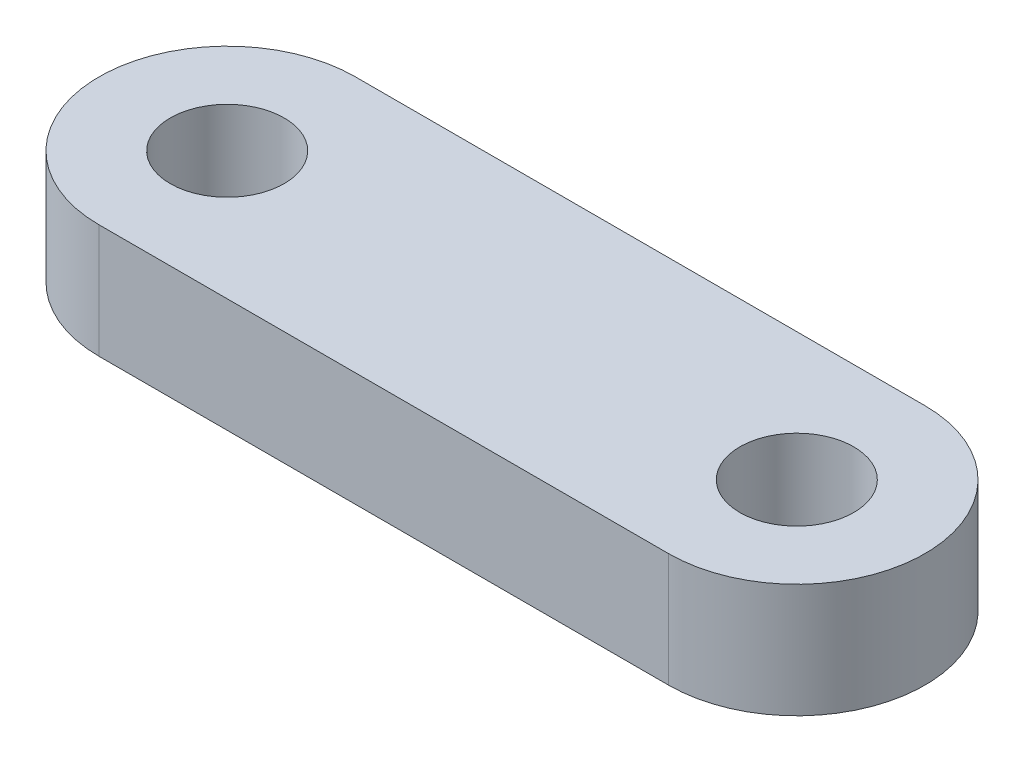
ISO-10303-21;
HEADER;
FILE_DESCRIPTION(('STEP AP214'),'2;1');
FILE_NAME('part.step','',(''),(''),'','','');
FILE_SCHEMA(('AUTOMOTIVE_DESIGN { 1 0 10303 214 1 1 1 1 }'));
ENDSEC;
DATA;
#1=APPLICATION_CONTEXT('core data for automotive mechanical design processes');
#2=APPLICATION_PROTOCOL_DEFINITION('international standard','automotive_design',2000,#1);
#3=PRODUCT_CONTEXT('',#1,'mechanical');
#4=PRODUCT('Part','Part','',(#3));
#5=PRODUCT_RELATED_PRODUCT_CATEGORY('part','',(#4));
#6=PRODUCT_DEFINITION_FORMATION('','',#4);
#7=PRODUCT_DEFINITION_CONTEXT('part definition',#1,'design');
#8=PRODUCT_DEFINITION('design','',#6,#7);
#9=PRODUCT_DEFINITION_SHAPE('','',#8);
#10=(LENGTH_UNIT() NAMED_UNIT(*) SI_UNIT(.MILLI.,.METRE.));
#11=(NAMED_UNIT(*) PLANE_ANGLE_UNIT() SI_UNIT($,.RADIAN.));
#12=(NAMED_UNIT(*) SI_UNIT($,.STERADIAN.) SOLID_ANGLE_UNIT());
#13=UNCERTAINTY_MEASURE_WITH_UNIT(LENGTH_MEASURE(1.E-05),#10,'distance_accuracy_value','');
#14=(GEOMETRIC_REPRESENTATION_CONTEXT(3) GLOBAL_UNCERTAINTY_ASSIGNED_CONTEXT((#13)) GLOBAL_UNIT_ASSIGNED_CONTEXT((#10,
#11,#12)) REPRESENTATION_CONTEXT('',''));
#15=CARTESIAN_POINT('',(0.,0.,0.));
#16=DIRECTION('',(0.,0.,1.));
#17=DIRECTION('',(1.,0.,0.));
#18=AXIS2_PLACEMENT_3D('',#15,#16,#17);
#19=CARTESIAN_POINT('',(0.,4.,0.));
#20=DIRECTION('',(0.,1.,0.));
#21=DIRECTION('',(0.,0.,1.));
#22=AXIS2_PLACEMENT_3D('',#19,#20,#21);
#23=PLANE('',#22);
#24=CARTESIAN_POINT('',(0.,4.,0.));
#25=DIRECTION('',(0.,1.,0.));
#26=DIRECTION('',(0.,0.,1.));
#27=AXIS2_PLACEMENT_3D('',#24,#25,#26);
#28=CIRCLE('',#27,2.);
#29=CARTESIAN_POINT('',(0.,4.,2.));
#30=VERTEX_POINT('',#29);
#31=EDGE_CURVE('E99',#30,#30,#28,.T.);
#32=ORIENTED_EDGE('',*,*,#31,.F.);
#33=EDGE_LOOP('',(#32));
#34=FACE_BOUND('',#33,.T.);
#35=CARTESIAN_POINT('',(0.,4.,0.));
#36=DIRECTION('',(0.,1.,0.));
#37=DIRECTION('',(0.,0.,1.));
#38=AXIS2_PLACEMENT_3D('',#35,#36,#37);
#39=CIRCLE('',#38,4.5);
#40=CARTESIAN_POINT('',(0.,4.,-4.5));
#41=VERTEX_POINT('',#40);
#42=CARTESIAN_POINT('',(0.,4.,4.5));
#43=VERTEX_POINT('',#42);
#44=EDGE_CURVE('E84',#41,#43,#39,.T.);
#45=ORIENTED_EDGE('',*,*,#44,.T.);
#46=DIRECTION('',(1.,0.,0.));
#47=VECTOR('',#46,1.);
#48=CARTESIAN_POINT('',(0.,4.,4.5));
#49=LINE('',#48,#47);
#50=CARTESIAN_POINT('',(20.,4.,4.5));
#51=VERTEX_POINT('',#50);
#52=EDGE_CURVE('E79',#43,#51,#49,.T.);
#53=ORIENTED_EDGE('',*,*,#52,.T.);
#54=CARTESIAN_POINT('',(20.,4.,0.));
#55=DIRECTION('',(0.,1.,0.));
#56=DIRECTION('',(0.,0.,1.));
#57=AXIS2_PLACEMENT_3D('',#54,#55,#56);
#58=CIRCLE('',#57,4.5);
#59=CARTESIAN_POINT('',(20.,4.,-4.5));
#60=VERTEX_POINT('',#59);
#61=EDGE_CURVE('E82',#51,#60,#58,.T.);
#62=ORIENTED_EDGE('',*,*,#61,.T.);
#63=DIRECTION('',(-1.,0.,0.));
#64=VECTOR('',#63,1.);
#65=CARTESIAN_POINT('',(0.,4.,-4.5));
#66=LINE('',#65,#64);
#67=EDGE_CURVE('E49',#60,#41,#66,.T.);
#68=ORIENTED_EDGE('',*,*,#67,.T.);
#69=EDGE_LOOP('',(#45,#53,#62,#68));
#70=FACE_BOUND('',#69,.T.);
#71=CARTESIAN_POINT('',(20.,4.,0.));
#72=DIRECTION('',(0.,1.,0.));
#73=DIRECTION('',(0.,0.,1.));
#74=AXIS2_PLACEMENT_3D('',#71,#72,#73);
#75=CIRCLE('',#74,2.);
#76=CARTESIAN_POINT('',(20.,4.,2.));
#77=VERTEX_POINT('',#76);
#78=EDGE_CURVE('E114',#77,#77,#75,.T.);
#79=ORIENTED_EDGE('',*,*,#78,.F.);
#80=EDGE_LOOP('',(#79));
#81=FACE_BOUND('',#80,.T.);
#82=ADVANCED_FACE('F32',(#34,#70,#81),#23,.T.);
#83=CARTESIAN_POINT('',(0.,0.,0.));
#84=DIRECTION('',(0.,1.,0.));
#85=DIRECTION('',(0.,0.,1.));
#86=AXIS2_PLACEMENT_3D('',#83,#84,#85);
#87=PLANE('',#86);
#88=CARTESIAN_POINT('',(0.,0.,0.));
#89=DIRECTION('',(0.,1.,0.));
#90=DIRECTION('',(0.,0.,1.));
#91=AXIS2_PLACEMENT_3D('',#88,#89,#90);
#92=CIRCLE('',#91,2.);
#93=CARTESIAN_POINT('',(0.,0.,2.));
#94=VERTEX_POINT('',#93);
#95=EDGE_CURVE('E111',#94,#94,#92,.T.);
#96=ORIENTED_EDGE('',*,*,#95,.T.);
#97=EDGE_LOOP('',(#96));
#98=FACE_BOUND('',#97,.T.);
#99=CARTESIAN_POINT('',(0.,0.,0.));
#100=DIRECTION('',(0.,1.,0.));
#101=DIRECTION('',(0.,0.,1.));
#102=AXIS2_PLACEMENT_3D('',#99,#100,#101);
#103=CIRCLE('',#102,4.5);
#104=CARTESIAN_POINT('',(0.,0.,-4.5));
#105=VERTEX_POINT('',#104);
#106=CARTESIAN_POINT('',(0.,0.,4.5));
#107=VERTEX_POINT('',#106);
#108=EDGE_CURVE('E96',#105,#107,#103,.T.);
#109=ORIENTED_EDGE('',*,*,#108,.F.);
#110=DIRECTION('',(-1.,0.,0.));
#111=VECTOR('',#110,1.);
#112=CARTESIAN_POINT('',(0.,0.,-4.5));
#113=LINE('',#112,#111);
#114=CARTESIAN_POINT('',(20.,0.,-4.5));
#115=VERTEX_POINT('',#114);
#116=EDGE_CURVE('E72',#115,#105,#113,.T.);
#117=ORIENTED_EDGE('',*,*,#116,.F.);
#118=CARTESIAN_POINT('',(20.,0.,0.));
#119=DIRECTION('',(0.,1.,0.));
#120=DIRECTION('',(0.,0.,1.));
#121=AXIS2_PLACEMENT_3D('',#118,#119,#120);
#122=CIRCLE('',#121,4.5);
#123=CARTESIAN_POINT('',(20.,0.,4.5));
#124=VERTEX_POINT('',#123);
#125=EDGE_CURVE('E66',#124,#115,#122,.T.);
#126=ORIENTED_EDGE('',*,*,#125,.F.);
#127=DIRECTION('',(1.,0.,0.));
#128=VECTOR('',#127,1.);
#129=CARTESIAN_POINT('',(0.,0.,4.5));
#130=LINE('',#129,#128);
#131=EDGE_CURVE('E88',#107,#124,#130,.T.);
#132=ORIENTED_EDGE('',*,*,#131,.F.);
#133=EDGE_LOOP('',(#109,#117,#126,#132));
#134=FACE_BOUND('',#133,.T.);
#135=CARTESIAN_POINT('',(20.,0.,0.));
#136=DIRECTION('',(0.,1.,0.));
#137=DIRECTION('',(0.,0.,1.));
#138=AXIS2_PLACEMENT_3D('',#135,#136,#137);
#139=CIRCLE('',#138,2.);
#140=CARTESIAN_POINT('',(20.,0.,2.));
#141=VERTEX_POINT('',#140);
#142=EDGE_CURVE('E117',#141,#141,#139,.T.);
#143=ORIENTED_EDGE('',*,*,#142,.T.);
#144=EDGE_LOOP('',(#143));
#145=FACE_BOUND('',#144,.T.);
#146=ADVANCED_FACE('F107',(#98,#134,#145),#87,.F.);
#147=CARTESIAN_POINT('',(0.,4.,0.));
#148=DIRECTION('',(0.,-1.,0.));
#149=DIRECTION('',(0.,0.,-1.));
#150=AXIS2_PLACEMENT_3D('',#147,#148,#149);
#151=CYLINDRICAL_SURFACE('',#150,4.5);
#152=ORIENTED_EDGE('',*,*,#108,.T.);
#153=DIRECTION('',(0.,-1.,0.));
#154=VECTOR('',#153,1.);
#155=CARTESIAN_POINT('',(0.,4.,4.5));
#156=LINE('',#155,#154);
#157=EDGE_CURVE('E11',#43,#107,#156,.T.);
#158=ORIENTED_EDGE('',*,*,#157,.F.);
#159=ORIENTED_EDGE('',*,*,#44,.F.);
#160=DIRECTION('',(0.,-1.,0.));
#161=VECTOR('',#160,1.);
#162=CARTESIAN_POINT('',(0.,4.,-4.5));
#163=LINE('',#162,#161);
#164=EDGE_CURVE('E92',#41,#105,#163,.T.);
#165=ORIENTED_EDGE('',*,*,#164,.T.);
#166=EDGE_LOOP('',(#152,#158,#159,#165));
#167=FACE_BOUND('',#166,.T.);
#168=ADVANCED_FACE('F34',(#167),#151,.T.);
#169=CARTESIAN_POINT('',(0.,4.,4.5));
#170=DIRECTION('',(0.,0.,-1.));
#171=DIRECTION('',(-1.,0.,0.));
#172=AXIS2_PLACEMENT_3D('',#169,#170,#171);
#173=PLANE('',#172);
#174=ORIENTED_EDGE('',*,*,#131,.T.);
#175=DIRECTION('',(0.,-1.,0.));
#176=VECTOR('',#175,1.);
#177=CARTESIAN_POINT('',(20.,4.,4.5));
#178=LINE('',#177,#176);
#179=EDGE_CURVE('E41',#51,#124,#178,.T.);
#180=ORIENTED_EDGE('',*,*,#179,.F.);
#181=ORIENTED_EDGE('',*,*,#52,.F.);
#182=ORIENTED_EDGE('',*,*,#157,.T.);
#183=EDGE_LOOP('',(#174,#180,#181,#182));
#184=FACE_BOUND('',#183,.T.);
#185=ADVANCED_FACE('F87',(#184),#173,.F.);
#186=CARTESIAN_POINT('',(20.,4.,0.));
#187=DIRECTION('',(0.,-1.,0.));
#188=DIRECTION('',(0.,0.,-1.));
#189=AXIS2_PLACEMENT_3D('',#186,#187,#188);
#190=CYLINDRICAL_SURFACE('',#189,4.5);
#191=ORIENTED_EDGE('',*,*,#125,.T.);
#192=DIRECTION('',(0.,-1.,0.));
#193=VECTOR('',#192,1.);
#194=CARTESIAN_POINT('',(20.,4.,-4.5));
#195=LINE('',#194,#193);
#196=EDGE_CURVE('E89',#60,#115,#195,.T.);
#197=ORIENTED_EDGE('',*,*,#196,.F.);
#198=ORIENTED_EDGE('',*,*,#61,.F.);
#199=ORIENTED_EDGE('',*,*,#179,.T.);
#200=EDGE_LOOP('',(#191,#197,#198,#199));
#201=FACE_BOUND('',#200,.T.);
#202=ADVANCED_FACE('F90',(#201),#190,.T.);
#203=CARTESIAN_POINT('',(0.,4.,-4.5));
#204=DIRECTION('',(0.,0.,1.));
#205=DIRECTION('',(1.,0.,0.));
#206=AXIS2_PLACEMENT_3D('',#203,#204,#205);
#207=PLANE('',#206);
#208=ORIENTED_EDGE('',*,*,#116,.T.);
#209=ORIENTED_EDGE('',*,*,#164,.F.);
#210=ORIENTED_EDGE('',*,*,#67,.F.);
#211=ORIENTED_EDGE('',*,*,#196,.T.);
#212=EDGE_LOOP('',(#208,#209,#210,#211));
#213=FACE_BOUND('',#212,.T.);
#214=ADVANCED_FACE('F104',(#213),#207,.F.);
#215=CARTESIAN_POINT('',(0.,4.,0.));
#216=DIRECTION('',(0.,-1.,0.));
#217=DIRECTION('',(0.,0.,-1.));
#218=AXIS2_PLACEMENT_3D('',#215,#216,#217);
#219=CYLINDRICAL_SURFACE('',#218,2.);
#220=ORIENTED_EDGE('',*,*,#31,.T.);
#221=EDGE_LOOP('',(#220));
#222=FACE_BOUND('',#221,.T.);
#223=ORIENTED_EDGE('',*,*,#95,.F.);
#224=EDGE_LOOP('',(#223));
#225=FACE_BOUND('',#224,.T.);
#226=ADVANCED_FACE('F135',(#222,#225),#219,.F.);
#227=CARTESIAN_POINT('',(20.,4.,0.));
#228=DIRECTION('',(0.,-1.,0.));
#229=DIRECTION('',(0.,0.,-1.));
#230=AXIS2_PLACEMENT_3D('',#227,#228,#229);
#231=CYLINDRICAL_SURFACE('',#230,2.);
#232=ORIENTED_EDGE('',*,*,#78,.T.);
#233=EDGE_LOOP('',(#232));
#234=FACE_BOUND('',#233,.T.);
#235=ORIENTED_EDGE('',*,*,#142,.F.);
#236=EDGE_LOOP('',(#235));
#237=FACE_BOUND('',#236,.T.);
#238=ADVANCED_FACE('F123',(#234,#237),#231,.F.);
#239=CLOSED_SHELL('',(#82,#146,#168,#185,#202,#214,#226,#238));
#240=MANIFOLD_SOLID_BREP('B2',#239);
#241=ADVANCED_BREP_SHAPE_REPRESENTATION('',(#18,#240),#14);
#242=SHAPE_DEFINITION_REPRESENTATION(#9,#241);
ENDSEC;
END-ISO-10303-21;
